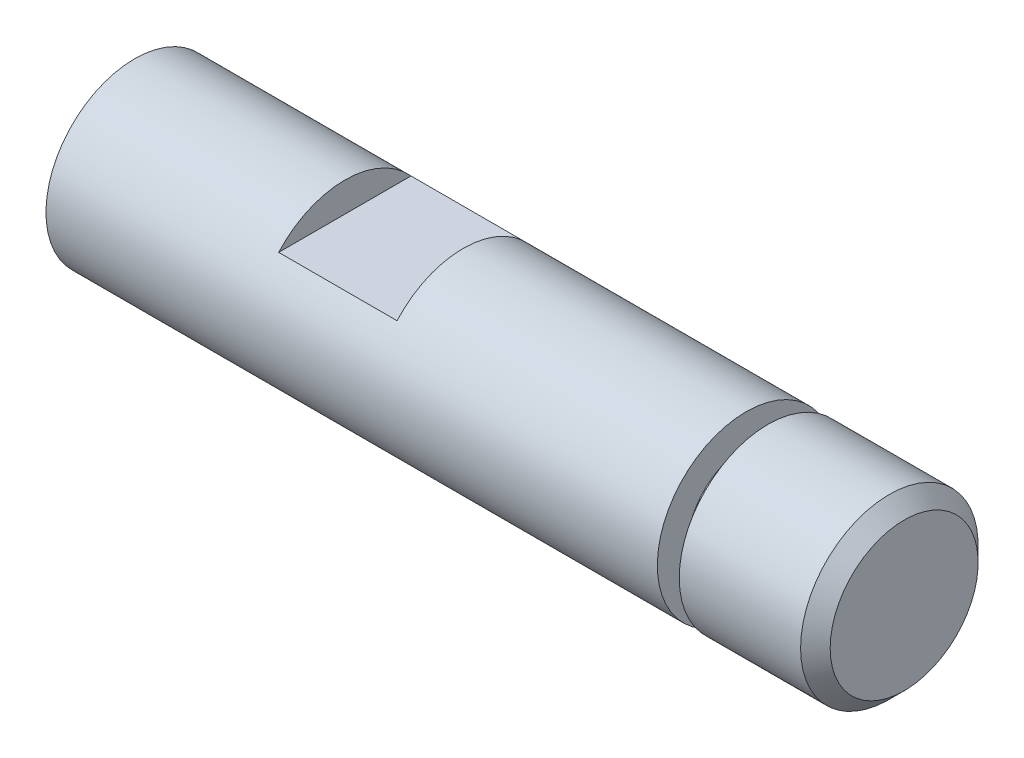
ISO-10303-21;
HEADER;
FILE_DESCRIPTION(('STEP AP214'),'2;1');
FILE_NAME('part.step','',(''),(''),'','','');
FILE_SCHEMA(('AUTOMOTIVE_DESIGN { 1 0 10303 214 1 1 1 1 }'));
ENDSEC;
DATA;
#1=APPLICATION_CONTEXT('core data for automotive mechanical design processes');
#2=APPLICATION_PROTOCOL_DEFINITION('international standard','automotive_design',2000,#1);
#3=PRODUCT_CONTEXT('',#1,'mechanical');
#4=PRODUCT('Part','Part','',(#3));
#5=PRODUCT_RELATED_PRODUCT_CATEGORY('part','',(#4));
#6=PRODUCT_DEFINITION_FORMATION('','',#4);
#7=PRODUCT_DEFINITION_CONTEXT('part definition',#1,'design');
#8=PRODUCT_DEFINITION('design','',#6,#7);
#9=PRODUCT_DEFINITION_SHAPE('','',#8);
#10=(LENGTH_UNIT() NAMED_UNIT(*) SI_UNIT(.MILLI.,.METRE.));
#11=(NAMED_UNIT(*) PLANE_ANGLE_UNIT() SI_UNIT($,.RADIAN.));
#12=(NAMED_UNIT(*) SI_UNIT($,.STERADIAN.) SOLID_ANGLE_UNIT());
#13=UNCERTAINTY_MEASURE_WITH_UNIT(LENGTH_MEASURE(1.E-05),#10,'distance_accuracy_value','');
#14=(GEOMETRIC_REPRESENTATION_CONTEXT(3) GLOBAL_UNCERTAINTY_ASSIGNED_CONTEXT((#13)) GLOBAL_UNIT_ASSIGNED_CONTEXT((#10,
#11,#12)) REPRESENTATION_CONTEXT('',''));
#15=CARTESIAN_POINT('',(0.,0.,0.));
#16=DIRECTION('',(0.,0.,1.));
#17=DIRECTION('',(1.,0.,0.));
#18=AXIS2_PLACEMENT_3D('',#15,#16,#17);
#19=CARTESIAN_POINT('',(0.,0.,0.));
#20=DIRECTION('',(-1.,0.,0.));
#21=DIRECTION('',(0.,0.,1.));
#22=AXIS2_PLACEMENT_3D('',#19,#20,#21);
#23=CYLINDRICAL_SURFACE('',#22,3.);
#24=CARTESIAN_POINT('',(20.66,0.,0.));
#25=DIRECTION('',(1.,0.,0.));
#26=DIRECTION('',(0.,1.,0.));
#27=AXIS2_PLACEMENT_3D('',#24,#25,#26);
#28=CIRCLE('',#27,3.);
#29=CARTESIAN_POINT('',(20.66,3.,0.));
#30=VERTEX_POINT('',#29);
#31=EDGE_CURVE('E82',#30,#30,#28,.T.);
#32=ORIENTED_EDGE('',*,*,#31,.F.);
#33=EDGE_LOOP('',(#32));
#34=FACE_BOUND('',#33,.T.);
#35=CARTESIAN_POINT('',(11.1,0.,0.));
#36=DIRECTION('',(-1.,0.,0.));
#37=DIRECTION('',(0.,0.,1.));
#38=AXIS2_PLACEMENT_3D('',#35,#36,#37);
#39=CIRCLE('',#38,3.);
#40=CARTESIAN_POINT('',(11.1,2.00000000000002,2.23606797749977));
#41=VERTEX_POINT('',#40);
#42=CARTESIAN_POINT('',(11.1,2.00000000000002,-2.23606797749977));
#43=VERTEX_POINT('',#42);
#44=EDGE_CURVE('E67',#41,#43,#39,.T.);
#45=ORIENTED_EDGE('',*,*,#44,.F.);
#46=DIRECTION('',(-1.,0.,0.));
#47=VECTOR('',#46,1.);
#48=CARTESIAN_POINT('',(0.,2.00000000000002,2.23606797749977));
#49=LINE('',#48,#47);
#50=CARTESIAN_POINT('',(7.1,2.00000000000002,2.23606797749977));
#51=VERTEX_POINT('',#50);
#52=EDGE_CURVE('E41',#41,#51,#49,.T.);
#53=ORIENTED_EDGE('',*,*,#52,.T.);
#54=CARTESIAN_POINT('',(7.1,0.,0.));
#55=DIRECTION('',(-1.,0.,0.));
#56=DIRECTION('',(0.,0.,1.));
#57=AXIS2_PLACEMENT_3D('',#54,#55,#56);
#58=CIRCLE('',#57,3.);
#59=CARTESIAN_POINT('',(7.1,2.00000000000002,-2.23606797749977));
#60=VERTEX_POINT('',#59);
#61=EDGE_CURVE('E55',#51,#60,#58,.T.);
#62=ORIENTED_EDGE('',*,*,#61,.T.);
#63=DIRECTION('',(-1.,0.,0.));
#64=VECTOR('',#63,1.);
#65=CARTESIAN_POINT('',(0.,2.00000000000002,-2.23606797749977));
#66=LINE('',#65,#64);
#67=EDGE_CURVE('E72',#60,#43,#66,.F.);
#68=ORIENTED_EDGE('',*,*,#67,.T.);
#69=EDGE_LOOP('',(#45,#53,#62,#68));
#70=FACE_BOUND('',#69,.T.);
#71=CARTESIAN_POINT('',(0.,0.,0.));
#72=DIRECTION('',(1.,0.,0.));
#73=DIRECTION('',(0.,1.,0.));
#74=AXIS2_PLACEMENT_3D('',#71,#72,#73);
#75=CIRCLE('',#74,3.);
#76=CARTESIAN_POINT('',(0.,3.,0.));
#77=VERTEX_POINT('',#76);
#78=EDGE_CURVE('E11',#77,#77,#75,.T.);
#79=ORIENTED_EDGE('',*,*,#78,.T.);
#80=EDGE_LOOP('',(#79));
#81=FACE_BOUND('',#80,.T.);
#82=ADVANCED_FACE('F33',(#34,#70,#81),#23,.T.);
#83=CARTESIAN_POINT('',(7.1,4.00000000000002,-3.));
#84=DIRECTION('',(-1.,0.,0.));
#85=DIRECTION('',(0.,0.,1.));
#86=AXIS2_PLACEMENT_3D('',#83,#84,#85);
#87=PLANE('',#86);
#88=DIRECTION('',(0.,0.,1.));
#89=VECTOR('',#88,1.);
#90=CARTESIAN_POINT('',(7.1,2.00000000000002,-3.));
#91=LINE('',#90,#89);
#92=EDGE_CURVE('E62',#60,#51,#91,.T.);
#93=ORIENTED_EDGE('',*,*,#92,.F.);
#94=ORIENTED_EDGE('',*,*,#61,.F.);
#95=EDGE_LOOP('',(#93,#94));
#96=FACE_BOUND('',#95,.T.);
#97=ADVANCED_FACE('F119',(#96),#87,.F.);
#98=CARTESIAN_POINT('',(11.1,4.00000000000002,-3.));
#99=DIRECTION('',(-1.,0.,0.));
#100=DIRECTION('',(0.,0.,1.));
#101=AXIS2_PLACEMENT_3D('',#98,#99,#100);
#102=PLANE('',#101);
#103=ORIENTED_EDGE('',*,*,#44,.T.);
#104=DIRECTION('',(0.,0.,1.));
#105=VECTOR('',#104,1.);
#106=CARTESIAN_POINT('',(11.1,2.00000000000002,-3.));
#107=LINE('',#106,#105);
#108=EDGE_CURVE('E48',#43,#41,#107,.T.);
#109=ORIENTED_EDGE('',*,*,#108,.T.);
#110=EDGE_LOOP('',(#103,#109));
#111=FACE_BOUND('',#110,.T.);
#112=ADVANCED_FACE('F66',(#111),#102,.T.);
#113=CARTESIAN_POINT('',(7.1,2.00000000000002,-3.));
#114=DIRECTION('',(0.,-1.,0.));
#115=DIRECTION('',(0.,0.,-1.));
#116=AXIS2_PLACEMENT_3D('',#113,#114,#115);
#117=PLANE('',#116);
#118=ORIENTED_EDGE('',*,*,#108,.F.);
#119=ORIENTED_EDGE('',*,*,#67,.F.);
#120=ORIENTED_EDGE('',*,*,#92,.T.);
#121=ORIENTED_EDGE('',*,*,#52,.F.);
#122=EDGE_LOOP('',(#118,#119,#120,#121));
#123=FACE_BOUND('',#122,.T.);
#124=ADVANCED_FACE('F61',(#123),#117,.F.);
#125=CARTESIAN_POINT('',(20.66,3.,0.));
#126=DIRECTION('',(-1.,0.,0.));
#127=DIRECTION('',(0.,-1.,0.));
#128=AXIS2_PLACEMENT_3D('',#125,#126,#127);
#129=PLANE('',#128);
#130=CARTESIAN_POINT('',(20.66,0.,0.));
#131=DIRECTION('',(1.,0.,0.));
#132=DIRECTION('',(0.,1.,0.));
#133=AXIS2_PLACEMENT_3D('',#130,#131,#132);
#134=CIRCLE('',#133,1.99999999999999);
#135=CARTESIAN_POINT('',(20.66,2.,0.));
#136=VERTEX_POINT('',#135);
#137=EDGE_CURVE('E86',#136,#136,#134,.T.);
#138=ORIENTED_EDGE('',*,*,#137,.F.);
#139=EDGE_LOOP('',(#138));
#140=FACE_BOUND('',#139,.T.);
#141=ORIENTED_EDGE('',*,*,#31,.T.);
#142=EDGE_LOOP('',(#141));
#143=FACE_BOUND('',#142,.T.);
#144=ADVANCED_FACE('F109',(#140,#143),#129,.F.);
#145=CARTESIAN_POINT('',(0.,0.,0.));
#146=DIRECTION('',(1.,0.,0.));
#147=DIRECTION('',(0.,1.,0.));
#148=AXIS2_PLACEMENT_3D('',#145,#146,#147);
#149=CYLINDRICAL_SURFACE('',#148,1.99999999999999);
#150=CARTESIAN_POINT('',(21.4,0.,0.));
#151=DIRECTION('',(1.,0.,0.));
#152=DIRECTION('',(0.,1.,0.));
#153=AXIS2_PLACEMENT_3D('',#150,#151,#152);
#154=CIRCLE('',#153,1.99999999999999);
#155=CARTESIAN_POINT('',(21.4,2.,0.));
#156=VERTEX_POINT('',#155);
#157=EDGE_CURVE('E89',#156,#156,#154,.T.);
#158=ORIENTED_EDGE('',*,*,#157,.F.);
#159=EDGE_LOOP('',(#158));
#160=FACE_BOUND('',#159,.T.);
#161=ORIENTED_EDGE('',*,*,#137,.T.);
#162=EDGE_LOOP('',(#161));
#163=FACE_BOUND('',#162,.T.);
#164=ADVANCED_FACE('F103',(#160,#163),#149,.T.);
#165=CARTESIAN_POINT('',(21.4,3.,0.));
#166=DIRECTION('',(1.,0.,0.));
#167=DIRECTION('',(0.,1.,0.));
#168=AXIS2_PLACEMENT_3D('',#165,#166,#167);
#169=PLANE('',#168);
#170=CARTESIAN_POINT('',(21.4,0.,0.));
#171=DIRECTION('',(1.,0.,0.));
#172=DIRECTION('',(0.,1.,0.));
#173=AXIS2_PLACEMENT_3D('',#170,#171,#172);
#174=CIRCLE('',#173,3.);
#175=CARTESIAN_POINT('',(21.4,3.,0.));
#176=VERTEX_POINT('',#175);
#177=EDGE_CURVE('E92',#176,#176,#174,.T.);
#178=ORIENTED_EDGE('',*,*,#177,.F.);
#179=EDGE_LOOP('',(#178));
#180=FACE_BOUND('',#179,.T.);
#181=ORIENTED_EDGE('',*,*,#157,.T.);
#182=EDGE_LOOP('',(#181));
#183=FACE_BOUND('',#182,.T.);
#184=ADVANCED_FACE('F99',(#180,#183),#169,.F.);
#185=CARTESIAN_POINT('',(26.,0.,0.));
#186=DIRECTION('',(-1.,0.,0.));
#187=DIRECTION('',(0.,0.,1.));
#188=AXIS2_PLACEMENT_3D('',#185,#186,#187);
#189=PLANE('',#188);
#190=CARTESIAN_POINT('',(26.,0.,0.));
#191=DIRECTION('',(-1.,0.,0.));
#192=DIRECTION('',(0.,0.,1.));
#193=AXIS2_PLACEMENT_3D('',#190,#191,#192);
#194=CIRCLE('',#193,2.50000000000002);
#195=CARTESIAN_POINT('',(26.,0.,2.50000000000002));
#196=VERTEX_POINT('',#195);
#197=EDGE_CURVE('E75',#196,#196,#194,.F.);
#198=ORIENTED_EDGE('',*,*,#197,.T.);
#199=EDGE_LOOP('',(#198));
#200=FACE_BOUND('',#199,.T.);
#201=ADVANCED_FACE('F102',(#200),#189,.F.);
#202=CARTESIAN_POINT('',(25.5,0.,0.));
#203=DIRECTION('',(-1.,0.,0.));
#204=DIRECTION('',(0.,0.,1.));
#205=AXIS2_PLACEMENT_3D('',#202,#203,#204);
#206=CONICAL_SURFACE('',#205,3.,0.785398163397453);
#207=ORIENTED_EDGE('',*,*,#197,.F.);
#208=EDGE_LOOP('',(#207));
#209=FACE_BOUND('',#208,.T.);
#210=CARTESIAN_POINT('',(25.5,0.,0.));
#211=DIRECTION('',(-1.,0.,0.));
#212=DIRECTION('',(0.,0.,1.));
#213=AXIS2_PLACEMENT_3D('',#210,#211,#212);
#214=CIRCLE('',#213,3.);
#215=CARTESIAN_POINT('',(25.5,0.,3.));
#216=VERTEX_POINT('',#215);
#217=EDGE_CURVE('E69',#216,#216,#214,.T.);
#218=ORIENTED_EDGE('',*,*,#217,.F.);
#219=EDGE_LOOP('',(#218));
#220=FACE_BOUND('',#219,.T.);
#221=ADVANCED_FACE('F35',(#209,#220),#206,.T.);
#222=ORIENTED_EDGE('',*,*,#177,.T.);
#223=EDGE_LOOP('',(#222));
#224=FACE_BOUND('',#223,.T.);
#225=ORIENTED_EDGE('',*,*,#217,.T.);
#226=EDGE_LOOP('',(#225));
#227=FACE_BOUND('',#226,.T.);
#228=ADVANCED_FACE('F96',(#224,#227),#23,.T.);
#229=CARTESIAN_POINT('',(0.,11.2061033139604,-3.));
#230=DIRECTION('',(1.,0.,0.));
#231=DIRECTION('',(0.,1.,0.));
#232=AXIS2_PLACEMENT_3D('',#229,#230,#231);
#233=PLANE('',#232);
#234=ORIENTED_EDGE('',*,*,#78,.F.);
#235=EDGE_LOOP('',(#234));
#236=FACE_BOUND('',#235,.T.);
#237=ADVANCED_FACE('F126',(#236),#233,.F.);
#238=CLOSED_SHELL('',(#82,#97,#112,#124,#144,#164,#184,#201,#221,#228,#237));
#239=MANIFOLD_SOLID_BREP('B2',#238);
#240=ADVANCED_BREP_SHAPE_REPRESENTATION('',(#18,#239),#14);
#241=SHAPE_DEFINITION_REPRESENTATION(#9,#240);
ENDSEC;
END-ISO-10303-21;
